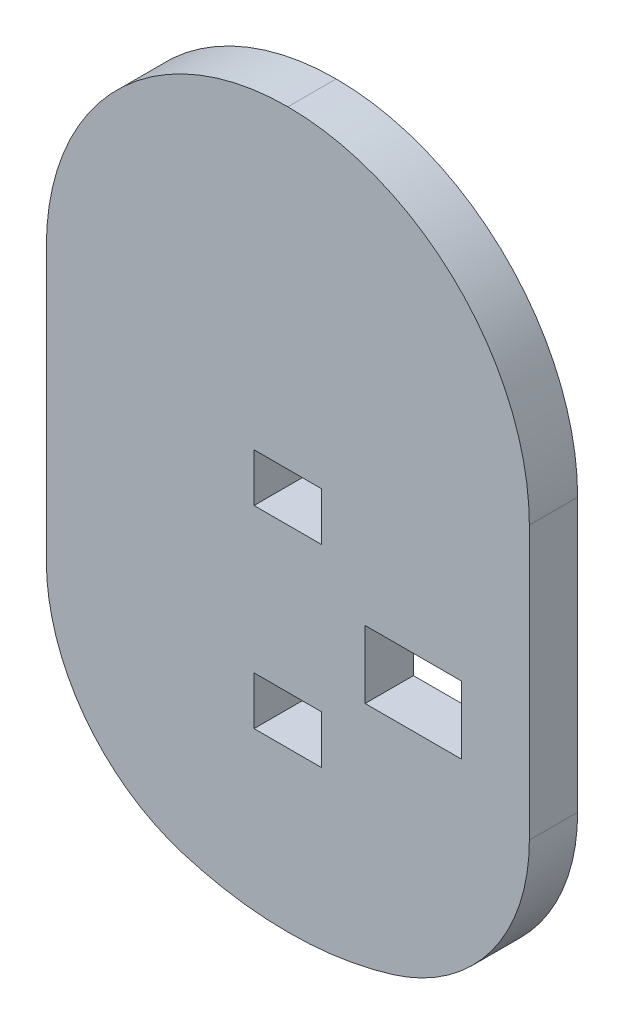
ISO-10303-21;
HEADER;
FILE_DESCRIPTION(('STEP AP214'),'2;1');
FILE_NAME('part.step','',(''),(''),'','','');
FILE_SCHEMA(('AUTOMOTIVE_DESIGN { 1 0 10303 214 1 1 1 1 }'));
ENDSEC;
DATA;
#1=APPLICATION_CONTEXT('core data for automotive mechanical design processes');
#2=APPLICATION_PROTOCOL_DEFINITION('international standard','automotive_design',2000,#1);
#3=PRODUCT_CONTEXT('',#1,'mechanical');
#4=PRODUCT('Part','Part','',(#3));
#5=PRODUCT_RELATED_PRODUCT_CATEGORY('part','',(#4));
#6=PRODUCT_DEFINITION_FORMATION('','',#4);
#7=PRODUCT_DEFINITION_CONTEXT('part definition',#1,'design');
#8=PRODUCT_DEFINITION('design','',#6,#7);
#9=PRODUCT_DEFINITION_SHAPE('','',#8);
#10=(LENGTH_UNIT() NAMED_UNIT(*) SI_UNIT(.MILLI.,.METRE.));
#11=(NAMED_UNIT(*) PLANE_ANGLE_UNIT() SI_UNIT($,.RADIAN.));
#12=(NAMED_UNIT(*) SI_UNIT($,.STERADIAN.) SOLID_ANGLE_UNIT());
#13=UNCERTAINTY_MEASURE_WITH_UNIT(LENGTH_MEASURE(1.E-05),#10,'distance_accuracy_value','');
#14=(GEOMETRIC_REPRESENTATION_CONTEXT(3) GLOBAL_UNCERTAINTY_ASSIGNED_CONTEXT((#13)) GLOBAL_UNIT_ASSIGNED_CONTEXT((#10,
#11,#12)) REPRESENTATION_CONTEXT('',''));
#15=CARTESIAN_POINT('',(0.,0.,0.));
#16=DIRECTION('',(0.,0.,1.));
#17=DIRECTION('',(1.,0.,0.));
#18=AXIS2_PLACEMENT_3D('',#15,#16,#17);
#19=CARTESIAN_POINT('',(0.,0.,5.));
#20=DIRECTION('',(0.,0.,-1.));
#21=DIRECTION('',(-1.,0.,0.));
#22=AXIS2_PLACEMENT_3D('',#19,#20,#21);
#23=CYLINDRICAL_SURFACE('',#22,37.);
#24=CARTESIAN_POINT('',(0.,0.,5.));
#25=DIRECTION('',(0.,0.,1.));
#26=DIRECTION('',(1.,0.,0.));
#27=AXIS2_PLACEMENT_3D('',#24,#25,#26);
#28=CIRCLE('',#27,37.);
#29=CARTESIAN_POINT('',(-10.8823529411765,-35.3634612907683,5.));
#30=VERTEX_POINT('',#29);
#31=CARTESIAN_POINT('',(10.8823529411765,-35.3634612907683,5.));
#32=VERTEX_POINT('',#31);
#33=EDGE_CURVE('E247',#30,#32,#28,.T.);
#34=ORIENTED_EDGE('',*,*,#33,.F.);
#35=DIRECTION('',(0.,0.,-1.));
#36=VECTOR('',#35,1.);
#37=CARTESIAN_POINT('',(-10.8823529411765,-35.3634612907683,5.));
#38=LINE('',#37,#36);
#39=CARTESIAN_POINT('',(-10.8823529411765,-35.3634612907683,0.));
#40=VERTEX_POINT('',#39);
#41=EDGE_CURVE('E283',#30,#40,#38,.T.);
#42=ORIENTED_EDGE('',*,*,#41,.T.);
#43=CARTESIAN_POINT('',(0.,0.,0.));
#44=DIRECTION('',(0.,0.,1.));
#45=DIRECTION('',(1.,0.,0.));
#46=AXIS2_PLACEMENT_3D('',#43,#44,#45);
#47=CIRCLE('',#46,37.);
#48=CARTESIAN_POINT('',(10.8823529411765,-35.3634612907683,0.));
#49=VERTEX_POINT('',#48);
#50=EDGE_CURVE('E243',#40,#49,#47,.T.);
#51=ORIENTED_EDGE('',*,*,#50,.T.);
#52=DIRECTION('',(0.,0.,-1.));
#53=VECTOR('',#52,1.);
#54=CARTESIAN_POINT('',(10.8823529411765,-35.3634612907683,5.));
#55=LINE('',#54,#53);
#56=EDGE_CURVE('E280',#49,#32,#55,.F.);
#57=ORIENTED_EDGE('',*,*,#56,.T.);
#58=EDGE_LOOP('',(#34,#42,#51,#57));
#59=FACE_BOUND('',#58,.T.);
#60=ADVANCED_FACE('F41',(#59),#23,.T.);
#61=CARTESIAN_POINT('',(0.,0.,5.));
#62=DIRECTION('',(0.,0.,1.));
#63=DIRECTION('',(1.,0.,0.));
#64=AXIS2_PLACEMENT_3D('',#61,#62,#63);
#65=PLANE('',#64);
#66=DIRECTION('',(0.,-1.,0.));
#67=VECTOR('',#66,1.);
#68=CARTESIAN_POINT('',(8.00000000000001,-5.5,5.));
#69=LINE('',#68,#67);
#70=CARTESIAN_POINT('',(8.00000000000001,-5.5,5.));
#71=VERTEX_POINT('',#70);
#72=CARTESIAN_POINT('',(8.,-12.5,5.));
#73=VERTEX_POINT('',#72);
#74=EDGE_CURVE('E56',#71,#73,#69,.T.);
#75=ORIENTED_EDGE('',*,*,#74,.F.);
#76=DIRECTION('',(-1.,0.,0.));
#77=VECTOR('',#76,1.);
#78=CARTESIAN_POINT('',(8.00000000000001,-5.5,5.));
#79=LINE('',#78,#77);
#80=CARTESIAN_POINT('',(18.,-5.5,5.));
#81=VERTEX_POINT('',#80);
#82=EDGE_CURVE('E191',#81,#71,#79,.T.);
#83=ORIENTED_EDGE('',*,*,#82,.F.);
#84=DIRECTION('',(0.,1.,0.));
#85=VECTOR('',#84,1.);
#86=CARTESIAN_POINT('',(18.,-5.5,5.));
#87=LINE('',#86,#85);
#88=CARTESIAN_POINT('',(18.,-12.5,5.));
#89=VERTEX_POINT('',#88);
#90=EDGE_CURVE('E175',#89,#81,#87,.T.);
#91=ORIENTED_EDGE('',*,*,#90,.F.);
#92=DIRECTION('',(1.,0.,0.));
#93=VECTOR('',#92,1.);
#94=CARTESIAN_POINT('',(8.,-12.5,5.));
#95=LINE('',#94,#93);
#96=EDGE_CURVE('E184',#73,#89,#95,.T.);
#97=ORIENTED_EDGE('',*,*,#96,.F.);
#98=EDGE_LOOP('',(#75,#83,#91,#97));
#99=FACE_BOUND('',#98,.T.);
#100=DIRECTION('',(0.,1.,0.));
#101=VECTOR('',#100,1.);
#102=CARTESIAN_POINT('',(3.5,4.5,5.));
#103=LINE('',#102,#101);
#104=CARTESIAN_POINT('',(3.5,-0.500000000000003,5.));
#105=VERTEX_POINT('',#104);
#106=CARTESIAN_POINT('',(3.5,4.5,5.));
#107=VERTEX_POINT('',#106);
#108=EDGE_CURVE('E201',#105,#107,#103,.T.);
#109=ORIENTED_EDGE('',*,*,#108,.F.);
#110=DIRECTION('',(1.,0.,0.));
#111=VECTOR('',#110,1.);
#112=CARTESIAN_POINT('',(-3.5,-0.500000000000003,5.));
#113=LINE('',#112,#111);
#114=CARTESIAN_POINT('',(-3.5,-0.500000000000003,5.));
#115=VERTEX_POINT('',#114);
#116=EDGE_CURVE('E210',#115,#105,#113,.T.);
#117=ORIENTED_EDGE('',*,*,#116,.F.);
#118=DIRECTION('',(0.,-1.,0.));
#119=VECTOR('',#118,1.);
#120=CARTESIAN_POINT('',(-3.5,4.5,5.));
#121=LINE('',#120,#119);
#122=CARTESIAN_POINT('',(-3.5,4.5,5.));
#123=VERTEX_POINT('',#122);
#124=EDGE_CURVE('E207',#123,#115,#121,.T.);
#125=ORIENTED_EDGE('',*,*,#124,.F.);
#126=DIRECTION('',(-1.,0.,0.));
#127=VECTOR('',#126,1.);
#128=CARTESIAN_POINT('',(-3.5,4.5,5.));
#129=LINE('',#128,#127);
#130=EDGE_CURVE('E203',#107,#123,#129,.T.);
#131=ORIENTED_EDGE('',*,*,#130,.F.);
#132=EDGE_LOOP('',(#109,#117,#125,#131));
#133=FACE_BOUND('',#132,.T.);
#134=DIRECTION('',(0.,1.,0.));
#135=VECTOR('',#134,1.);
#136=CARTESIAN_POINT('',(3.5,-15.5,5.));
#137=LINE('',#136,#135);
#138=CARTESIAN_POINT('',(3.5,-20.5,5.));
#139=VERTEX_POINT('',#138);
#140=CARTESIAN_POINT('',(3.5,-15.5,5.));
#141=VERTEX_POINT('',#140);
#142=EDGE_CURVE('E198',#139,#141,#137,.T.);
#143=ORIENTED_EDGE('',*,*,#142,.F.);
#144=DIRECTION('',(1.,0.,0.));
#145=VECTOR('',#144,1.);
#146=CARTESIAN_POINT('',(-3.5,-20.5,5.));
#147=LINE('',#146,#145);
#148=CARTESIAN_POINT('',(-3.5,-20.5,5.));
#149=VERTEX_POINT('',#148);
#150=EDGE_CURVE('E230',#149,#139,#147,.T.);
#151=ORIENTED_EDGE('',*,*,#150,.F.);
#152=DIRECTION('',(0.,-1.,0.));
#153=VECTOR('',#152,1.);
#154=CARTESIAN_POINT('',(-3.5,-15.5,5.));
#155=LINE('',#154,#153);
#156=CARTESIAN_POINT('',(-3.5,-15.5,5.));
#157=VERTEX_POINT('',#156);
#158=EDGE_CURVE('E227',#157,#149,#155,.T.);
#159=ORIENTED_EDGE('',*,*,#158,.F.);
#160=DIRECTION('',(-1.,0.,0.));
#161=VECTOR('',#160,1.);
#162=CARTESIAN_POINT('',(-3.5,-15.5,5.));
#163=LINE('',#162,#161);
#164=EDGE_CURVE('E224',#141,#157,#163,.T.);
#165=ORIENTED_EDGE('',*,*,#164,.F.);
#166=EDGE_LOOP('',(#143,#151,#159,#165));
#167=FACE_BOUND('',#166,.T.);
#168=DIRECTION('',(0.,1.,0.));
#169=VECTOR('',#168,1.);
#170=CARTESIAN_POINT('',(-25.,27.2763633939717,5.));
#171=LINE('',#170,#169);
#172=CARTESIAN_POINT('',(-25.,-16.2480768092719,5.));
#173=VERTEX_POINT('',#172);
#174=CARTESIAN_POINT('',(-25.,12.,5.));
#175=VERTEX_POINT('',#174);
#176=EDGE_CURVE('E241',#173,#175,#171,.T.);
#177=ORIENTED_EDGE('',*,*,#176,.F.);
#178=CARTESIAN_POINT('',(-5.,-16.2480768092719,5.));
#179=DIRECTION('',(0.,0.,1.));
#180=DIRECTION('',(1.,0.,0.));
#181=AXIS2_PLACEMENT_3D('',#178,#179,#180);
#182=CIRCLE('',#181,20.);
#183=EDGE_CURVE('E278',#173,#30,#182,.T.);
#184=ORIENTED_EDGE('',*,*,#183,.T.);
#185=ORIENTED_EDGE('',*,*,#33,.T.);
#186=CARTESIAN_POINT('',(5.,-16.2480768092719,5.));
#187=DIRECTION('',(0.,0.,1.));
#188=DIRECTION('',(1.,0.,0.));
#189=AXIS2_PLACEMENT_3D('',#186,#187,#188);
#190=CIRCLE('',#189,20.);
#191=CARTESIAN_POINT('',(25.,-16.2480768092719,5.));
#192=VERTEX_POINT('',#191);
#193=EDGE_CURVE('E276',#32,#192,#190,.T.);
#194=ORIENTED_EDGE('',*,*,#193,.T.);
#195=DIRECTION('',(0.,-1.,0.));
#196=VECTOR('',#195,1.);
#197=CARTESIAN_POINT('',(25.,-27.2763633939717,5.));
#198=LINE('',#197,#196);
#199=CARTESIAN_POINT('',(25.,12.,5.));
#200=VERTEX_POINT('',#199);
#201=EDGE_CURVE('E244',#200,#192,#198,.T.);
#202=ORIENTED_EDGE('',*,*,#201,.F.);
#203=CARTESIAN_POINT('',(0.,12.,5.));
#204=DIRECTION('',(0.,0.,1.));
#205=DIRECTION('',(1.,0.,0.));
#206=AXIS2_PLACEMENT_3D('',#203,#204,#205);
#207=CIRCLE('',#206,25.);
#208=CARTESIAN_POINT('',(0.,37.,5.));
#209=VERTEX_POINT('',#208);
#210=EDGE_CURVE('E257',#200,#209,#207,.T.);
#211=ORIENTED_EDGE('',*,*,#210,.T.);
#212=CARTESIAN_POINT('',(0.,12.,5.));
#213=DIRECTION('',(0.,0.,1.));
#214=DIRECTION('',(1.,0.,0.));
#215=AXIS2_PLACEMENT_3D('',#212,#213,#214);
#216=CIRCLE('',#215,25.);
#217=EDGE_CURVE('E259',#209,#175,#216,.T.);
#218=ORIENTED_EDGE('',*,*,#217,.T.);
#219=EDGE_LOOP('',(#177,#184,#185,#194,#202,#211,#218));
#220=FACE_BOUND('',#219,.T.);
#221=ADVANCED_FACE('F188',(#99,#133,#167,#220),#65,.T.);
#222=CARTESIAN_POINT('',(0.,0.,0.));
#223=DIRECTION('',(0.,0.,1.));
#224=DIRECTION('',(1.,0.,0.));
#225=AXIS2_PLACEMENT_3D('',#222,#223,#224);
#226=PLANE('',#225);
#227=DIRECTION('',(-1.,0.,0.));
#228=VECTOR('',#227,1.);
#229=CARTESIAN_POINT('',(0.,-5.5,0.));
#230=LINE('',#229,#228);
#231=CARTESIAN_POINT('',(18.,-5.5,0.));
#232=VERTEX_POINT('',#231);
#233=CARTESIAN_POINT('',(8.00000000000001,-5.5,0.));
#234=VERTEX_POINT('',#233);
#235=EDGE_CURVE('E49',#232,#234,#230,.T.);
#236=ORIENTED_EDGE('',*,*,#235,.T.);
#237=DIRECTION('',(0.,-1.,0.));
#238=VECTOR('',#237,1.);
#239=CARTESIAN_POINT('',(8.00000000000001,0.,0.));
#240=LINE('',#239,#238);
#241=CARTESIAN_POINT('',(8.,-12.5,0.));
#242=VERTEX_POINT('',#241);
#243=EDGE_CURVE('E11',#234,#242,#240,.T.);
#244=ORIENTED_EDGE('',*,*,#243,.T.);
#245=DIRECTION('',(1.,0.,0.));
#246=VECTOR('',#245,1.);
#247=CARTESIAN_POINT('',(0.,-12.5,0.));
#248=LINE('',#247,#246);
#249=CARTESIAN_POINT('',(18.,-12.5,0.));
#250=VERTEX_POINT('',#249);
#251=EDGE_CURVE('E315',#242,#250,#248,.T.);
#252=ORIENTED_EDGE('',*,*,#251,.T.);
#253=DIRECTION('',(0.,1.,0.));
#254=VECTOR('',#253,1.);
#255=CARTESIAN_POINT('',(18.,0.,0.));
#256=LINE('',#255,#254);
#257=EDGE_CURVE('E178',#250,#232,#256,.T.);
#258=ORIENTED_EDGE('',*,*,#257,.T.);
#259=EDGE_LOOP('',(#236,#244,#252,#258));
#260=FACE_BOUND('',#259,.T.);
#261=DIRECTION('',(1.,0.,0.));
#262=VECTOR('',#261,1.);
#263=CARTESIAN_POINT('',(0.,-0.500000000000003,0.));
#264=LINE('',#263,#262);
#265=CARTESIAN_POINT('',(-3.5,-0.500000000000003,0.));
#266=VERTEX_POINT('',#265);
#267=CARTESIAN_POINT('',(3.5,-0.500000000000003,0.));
#268=VERTEX_POINT('',#267);
#269=EDGE_CURVE('E309',#266,#268,#264,.T.);
#270=ORIENTED_EDGE('',*,*,#269,.T.);
#271=DIRECTION('',(0.,1.,0.));
#272=VECTOR('',#271,1.);
#273=CARTESIAN_POINT('',(3.5,0.,0.));
#274=LINE('',#273,#272);
#275=CARTESIAN_POINT('',(3.5,4.5,0.));
#276=VERTEX_POINT('',#275);
#277=EDGE_CURVE('E312',#268,#276,#274,.T.);
#278=ORIENTED_EDGE('',*,*,#277,.T.);
#279=DIRECTION('',(-1.,0.,0.));
#280=VECTOR('',#279,1.);
#281=CARTESIAN_POINT('',(0.,4.5,0.));
#282=LINE('',#281,#280);
#283=CARTESIAN_POINT('',(-3.5,4.5,0.));
#284=VERTEX_POINT('',#283);
#285=EDGE_CURVE('E303',#276,#284,#282,.T.);
#286=ORIENTED_EDGE('',*,*,#285,.T.);
#287=DIRECTION('',(0.,-1.,0.));
#288=VECTOR('',#287,1.);
#289=CARTESIAN_POINT('',(-3.5,0.,0.));
#290=LINE('',#289,#288);
#291=EDGE_CURVE('E306',#284,#266,#290,.T.);
#292=ORIENTED_EDGE('',*,*,#291,.T.);
#293=EDGE_LOOP('',(#270,#278,#286,#292));
#294=FACE_BOUND('',#293,.T.);
#295=DIRECTION('',(1.,0.,0.));
#296=VECTOR('',#295,1.);
#297=CARTESIAN_POINT('',(0.,-20.5,0.));
#298=LINE('',#297,#296);
#299=CARTESIAN_POINT('',(-3.5,-20.5,0.));
#300=VERTEX_POINT('',#299);
#301=CARTESIAN_POINT('',(3.5,-20.5,0.));
#302=VERTEX_POINT('',#301);
#303=EDGE_CURVE('E297',#300,#302,#298,.T.);
#304=ORIENTED_EDGE('',*,*,#303,.T.);
#305=DIRECTION('',(0.,1.,0.));
#306=VECTOR('',#305,1.);
#307=CARTESIAN_POINT('',(3.5,0.,0.));
#308=LINE('',#307,#306);
#309=CARTESIAN_POINT('',(3.5,-15.5,0.));
#310=VERTEX_POINT('',#309);
#311=EDGE_CURVE('E300',#302,#310,#308,.T.);
#312=ORIENTED_EDGE('',*,*,#311,.T.);
#313=DIRECTION('',(-1.,0.,0.));
#314=VECTOR('',#313,1.);
#315=CARTESIAN_POINT('',(0.,-15.5,0.));
#316=LINE('',#315,#314);
#317=CARTESIAN_POINT('',(-3.5,-15.5,0.));
#318=VERTEX_POINT('',#317);
#319=EDGE_CURVE('E291',#310,#318,#316,.T.);
#320=ORIENTED_EDGE('',*,*,#319,.T.);
#321=DIRECTION('',(0.,-1.,0.));
#322=VECTOR('',#321,1.);
#323=CARTESIAN_POINT('',(-3.5,0.,0.));
#324=LINE('',#323,#322);
#325=EDGE_CURVE('E294',#318,#300,#324,.T.);
#326=ORIENTED_EDGE('',*,*,#325,.T.);
#327=EDGE_LOOP('',(#304,#312,#320,#326));
#328=FACE_BOUND('',#327,.T.);
#329=ORIENTED_EDGE('',*,*,#50,.F.);
#330=CARTESIAN_POINT('',(-5.,-16.2480768092719,0.));
#331=DIRECTION('',(0.,0.,1.));
#332=DIRECTION('',(1.,0.,0.));
#333=AXIS2_PLACEMENT_3D('',#330,#331,#332);
#334=CIRCLE('',#333,20.);
#335=CARTESIAN_POINT('',(-25.,-16.2480768092719,0.));
#336=VERTEX_POINT('',#335);
#337=EDGE_CURVE('E287',#40,#336,#334,.F.);
#338=ORIENTED_EDGE('',*,*,#337,.T.);
#339=DIRECTION('',(0.,1.,0.));
#340=VECTOR('',#339,1.);
#341=CARTESIAN_POINT('',(-25.,0.,0.));
#342=LINE('',#341,#340);
#343=CARTESIAN_POINT('',(-25.,12.,0.));
#344=VERTEX_POINT('',#343);
#345=EDGE_CURVE('E255',#336,#344,#342,.T.);
#346=ORIENTED_EDGE('',*,*,#345,.T.);
#347=CARTESIAN_POINT('',(0.,12.,0.));
#348=DIRECTION('',(0.,0.,1.));
#349=DIRECTION('',(1.,0.,0.));
#350=AXIS2_PLACEMENT_3D('',#347,#348,#349);
#351=CIRCLE('',#350,25.);
#352=CARTESIAN_POINT('',(0.,37.,0.));
#353=VERTEX_POINT('',#352);
#354=EDGE_CURVE('E267',#344,#353,#351,.F.);
#355=ORIENTED_EDGE('',*,*,#354,.T.);
#356=CARTESIAN_POINT('',(0.,12.,0.));
#357=DIRECTION('',(0.,0.,1.));
#358=DIRECTION('',(1.,0.,0.));
#359=AXIS2_PLACEMENT_3D('',#356,#357,#358);
#360=CIRCLE('',#359,25.);
#361=CARTESIAN_POINT('',(25.,12.,0.));
#362=VERTEX_POINT('',#361);
#363=EDGE_CURVE('E265',#353,#362,#360,.F.);
#364=ORIENTED_EDGE('',*,*,#363,.T.);
#365=DIRECTION('',(0.,-1.,0.));
#366=VECTOR('',#365,1.);
#367=CARTESIAN_POINT('',(25.,0.,0.));
#368=LINE('',#367,#366);
#369=CARTESIAN_POINT('',(25.,-16.2480768092719,0.));
#370=VERTEX_POINT('',#369);
#371=EDGE_CURVE('E250',#362,#370,#368,.T.);
#372=ORIENTED_EDGE('',*,*,#371,.T.);
#373=CARTESIAN_POINT('',(5.,-16.2480768092719,0.));
#374=DIRECTION('',(0.,0.,1.));
#375=DIRECTION('',(1.,0.,0.));
#376=AXIS2_PLACEMENT_3D('',#373,#374,#375);
#377=CIRCLE('',#376,20.);
#378=EDGE_CURVE('E285',#370,#49,#377,.F.);
#379=ORIENTED_EDGE('',*,*,#378,.T.);
#380=EDGE_LOOP('',(#329,#338,#346,#355,#364,#372,#379));
#381=FACE_BOUND('',#380,.T.);
#382=ADVANCED_FACE('F319',(#260,#294,#328,#381),#226,.F.);
#383=CARTESIAN_POINT('',(25.,-27.2763633939717,-5.));
#384=DIRECTION('',(-1.,0.,0.));
#385=DIRECTION('',(0.,0.,1.));
#386=AXIS2_PLACEMENT_3D('',#383,#384,#385);
#387=PLANE('',#386);
#388=ORIENTED_EDGE('',*,*,#201,.T.);
#389=DIRECTION('',(0.,0.,-1.));
#390=VECTOR('',#389,1.);
#391=CARTESIAN_POINT('',(25.,-16.2480768092719,-5.));
#392=LINE('',#391,#390);
#393=EDGE_CURVE('E289',#192,#370,#392,.T.);
#394=ORIENTED_EDGE('',*,*,#393,.T.);
#395=ORIENTED_EDGE('',*,*,#371,.F.);
#396=DIRECTION('',(0.,0.,-1.));
#397=VECTOR('',#396,1.);
#398=CARTESIAN_POINT('',(25.,12.,-5.));
#399=LINE('',#398,#397);
#400=EDGE_CURVE('E269',#362,#200,#399,.F.);
#401=ORIENTED_EDGE('',*,*,#400,.T.);
#402=EDGE_LOOP('',(#388,#394,#395,#401));
#403=FACE_BOUND('',#402,.T.);
#404=ADVANCED_FACE('F382',(#403),#387,.F.);
#405=CARTESIAN_POINT('',(-25.,27.2763633939717,-5.));
#406=DIRECTION('',(1.,0.,0.));
#407=DIRECTION('',(0.,0.,-1.));
#408=AXIS2_PLACEMENT_3D('',#405,#406,#407);
#409=PLANE('',#408);
#410=ORIENTED_EDGE('',*,*,#345,.F.);
#411=DIRECTION('',(0.,0.,-1.));
#412=VECTOR('',#411,1.);
#413=CARTESIAN_POINT('',(-25.,-16.2480768092719,-5.));
#414=LINE('',#413,#412);
#415=EDGE_CURVE('E271',#336,#173,#414,.F.);
#416=ORIENTED_EDGE('',*,*,#415,.T.);
#417=ORIENTED_EDGE('',*,*,#176,.T.);
#418=DIRECTION('',(0.,0.,-1.));
#419=VECTOR('',#418,1.);
#420=CARTESIAN_POINT('',(-25.,12.,-5.));
#421=LINE('',#420,#419);
#422=EDGE_CURVE('E262',#175,#344,#421,.T.);
#423=ORIENTED_EDGE('',*,*,#422,.T.);
#424=EDGE_LOOP('',(#410,#416,#417,#423));
#425=FACE_BOUND('',#424,.T.);
#426=ADVANCED_FACE('F355',(#425),#409,.F.);
#427=CARTESIAN_POINT('',(0.,12.,5.));
#428=DIRECTION('',(0.,0.,-1.));
#429=DIRECTION('',(-1.,0.,0.));
#430=AXIS2_PLACEMENT_3D('',#427,#428,#429);
#431=CYLINDRICAL_SURFACE('',#430,25.);
#432=ORIENTED_EDGE('',*,*,#400,.F.);
#433=ORIENTED_EDGE('',*,*,#363,.F.);
#434=DIRECTION('',(0.,0.,-1.));
#435=VECTOR('',#434,1.);
#436=CARTESIAN_POINT('',(0.,37.,5.));
#437=LINE('',#436,#435);
#438=EDGE_CURVE('E216',#209,#353,#437,.T.);
#439=ORIENTED_EDGE('',*,*,#438,.F.);
#440=ORIENTED_EDGE('',*,*,#210,.F.);
#441=EDGE_LOOP('',(#432,#433,#439,#440));
#442=FACE_BOUND('',#441,.T.);
#443=ADVANCED_FACE('F352',(#442),#431,.T.);
#444=CARTESIAN_POINT('',(0.,12.,5.));
#445=DIRECTION('',(0.,0.,-1.));
#446=DIRECTION('',(-1.,0.,0.));
#447=AXIS2_PLACEMENT_3D('',#444,#445,#446);
#448=CYLINDRICAL_SURFACE('',#447,25.);
#449=ORIENTED_EDGE('',*,*,#354,.F.);
#450=ORIENTED_EDGE('',*,*,#422,.F.);
#451=ORIENTED_EDGE('',*,*,#217,.F.);
#452=ORIENTED_EDGE('',*,*,#438,.T.);
#453=EDGE_LOOP('',(#449,#450,#451,#452));
#454=FACE_BOUND('',#453,.T.);
#455=ADVANCED_FACE('F348',(#454),#448,.T.);
#456=CARTESIAN_POINT('',(-5.,-16.2480768092719,5.));
#457=DIRECTION('',(0.,0.,-1.));
#458=DIRECTION('',(-1.,0.,0.));
#459=AXIS2_PLACEMENT_3D('',#456,#457,#458);
#460=CYLINDRICAL_SURFACE('',#459,20.);
#461=ORIENTED_EDGE('',*,*,#337,.F.);
#462=ORIENTED_EDGE('',*,*,#41,.F.);
#463=ORIENTED_EDGE('',*,*,#183,.F.);
#464=ORIENTED_EDGE('',*,*,#415,.F.);
#465=EDGE_LOOP('',(#461,#462,#463,#464));
#466=FACE_BOUND('',#465,.T.);
#467=ADVANCED_FACE('F351',(#466),#460,.T.);
#468=CARTESIAN_POINT('',(5.,-16.2480768092719,5.));
#469=DIRECTION('',(0.,0.,-1.));
#470=DIRECTION('',(-1.,0.,0.));
#471=AXIS2_PLACEMENT_3D('',#468,#469,#470);
#472=CYLINDRICAL_SURFACE('',#471,20.);
#473=ORIENTED_EDGE('',*,*,#378,.F.);
#474=ORIENTED_EDGE('',*,*,#393,.F.);
#475=ORIENTED_EDGE('',*,*,#193,.F.);
#476=ORIENTED_EDGE('',*,*,#56,.F.);
#477=EDGE_LOOP('',(#473,#474,#475,#476));
#478=FACE_BOUND('',#477,.T.);
#479=ADVANCED_FACE('F43',(#478),#472,.T.);
#480=CARTESIAN_POINT('',(3.5,-15.5,-5.));
#481=DIRECTION('',(1.,0.,0.));
#482=DIRECTION('',(0.,1.,0.));
#483=AXIS2_PLACEMENT_3D('',#480,#481,#482);
#484=PLANE('',#483);
#485=DIRECTION('',(0.,0.,1.));
#486=VECTOR('',#485,1.);
#487=CARTESIAN_POINT('',(3.5,-20.5,-5.));
#488=LINE('',#487,#486);
#489=EDGE_CURVE('E204',#302,#139,#488,.T.);
#490=ORIENTED_EDGE('',*,*,#489,.T.);
#491=ORIENTED_EDGE('',*,*,#142,.T.);
#492=DIRECTION('',(0.,0.,1.));
#493=VECTOR('',#492,1.);
#494=CARTESIAN_POINT('',(3.5,-15.5,-5.));
#495=LINE('',#494,#493);
#496=EDGE_CURVE('E233',#310,#141,#495,.T.);
#497=ORIENTED_EDGE('',*,*,#496,.F.);
#498=ORIENTED_EDGE('',*,*,#311,.F.);
#499=EDGE_LOOP('',(#490,#491,#497,#498));
#500=FACE_BOUND('',#499,.T.);
#501=ADVANCED_FACE('F362',(#500),#484,.F.);
#502=CARTESIAN_POINT('',(-3.5,-20.5,-5.));
#503=DIRECTION('',(0.,-1.,0.));
#504=DIRECTION('',(0.,0.,-1.));
#505=AXIS2_PLACEMENT_3D('',#502,#503,#504);
#506=PLANE('',#505);
#507=DIRECTION('',(0.,0.,1.));
#508=VECTOR('',#507,1.);
#509=CARTESIAN_POINT('',(-3.5,-20.5,-5.));
#510=LINE('',#509,#508);
#511=EDGE_CURVE('E235',#300,#149,#510,.T.);
#512=ORIENTED_EDGE('',*,*,#511,.T.);
#513=ORIENTED_EDGE('',*,*,#150,.T.);
#514=ORIENTED_EDGE('',*,*,#489,.F.);
#515=ORIENTED_EDGE('',*,*,#303,.F.);
#516=EDGE_LOOP('',(#512,#513,#514,#515));
#517=FACE_BOUND('',#516,.T.);
#518=ADVANCED_FACE('F397',(#517),#506,.F.);
#519=CARTESIAN_POINT('',(-3.5,-15.5,-5.));
#520=DIRECTION('',(-1.,0.,0.));
#521=DIRECTION('',(0.,-1.,0.));
#522=AXIS2_PLACEMENT_3D('',#519,#520,#521);
#523=PLANE('',#522);
#524=DIRECTION('',(0.,0.,1.));
#525=VECTOR('',#524,1.);
#526=CARTESIAN_POINT('',(-3.5,-15.5,-5.));
#527=LINE('',#526,#525);
#528=EDGE_CURVE('E237',#318,#157,#527,.T.);
#529=ORIENTED_EDGE('',*,*,#528,.T.);
#530=ORIENTED_EDGE('',*,*,#158,.T.);
#531=ORIENTED_EDGE('',*,*,#511,.F.);
#532=ORIENTED_EDGE('',*,*,#325,.F.);
#533=EDGE_LOOP('',(#529,#530,#531,#532));
#534=FACE_BOUND('',#533,.T.);
#535=ADVANCED_FACE('F403',(#534),#523,.F.);
#536=CARTESIAN_POINT('',(-3.5,-15.5,-5.));
#537=DIRECTION('',(0.,1.,0.));
#538=DIRECTION('',(0.,0.,1.));
#539=AXIS2_PLACEMENT_3D('',#536,#537,#538);
#540=PLANE('',#539);
#541=ORIENTED_EDGE('',*,*,#496,.T.);
#542=ORIENTED_EDGE('',*,*,#164,.T.);
#543=ORIENTED_EDGE('',*,*,#528,.F.);
#544=ORIENTED_EDGE('',*,*,#319,.F.);
#545=EDGE_LOOP('',(#541,#542,#543,#544));
#546=FACE_BOUND('',#545,.T.);
#547=ADVANCED_FACE('F399',(#546),#540,.F.);
#548=CARTESIAN_POINT('',(3.5,4.5,-5.));
#549=DIRECTION('',(1.,0.,0.));
#550=DIRECTION('',(0.,1.,0.));
#551=AXIS2_PLACEMENT_3D('',#548,#549,#550);
#552=PLANE('',#551);
#553=DIRECTION('',(0.,0.,1.));
#554=VECTOR('',#553,1.);
#555=CARTESIAN_POINT('',(3.5,-0.500000000000003,-5.));
#556=LINE('',#555,#554);
#557=EDGE_CURVE('E214',#268,#105,#556,.T.);
#558=ORIENTED_EDGE('',*,*,#557,.T.);
#559=ORIENTED_EDGE('',*,*,#108,.T.);
#560=DIRECTION('',(0.,0.,1.));
#561=VECTOR('',#560,1.);
#562=CARTESIAN_POINT('',(3.5,4.5,-5.));
#563=LINE('',#562,#561);
#564=EDGE_CURVE('E213',#276,#107,#563,.T.);
#565=ORIENTED_EDGE('',*,*,#564,.F.);
#566=ORIENTED_EDGE('',*,*,#277,.F.);
#567=EDGE_LOOP('',(#558,#559,#565,#566));
#568=FACE_BOUND('',#567,.T.);
#569=ADVANCED_FACE('F402',(#568),#552,.F.);
#570=CARTESIAN_POINT('',(-3.5,-0.500000000000003,-5.));
#571=DIRECTION('',(0.,-1.,0.));
#572=DIRECTION('',(0.,0.,-1.));
#573=AXIS2_PLACEMENT_3D('',#570,#571,#572);
#574=PLANE('',#573);
#575=DIRECTION('',(0.,0.,1.));
#576=VECTOR('',#575,1.);
#577=CARTESIAN_POINT('',(-3.5,-0.500000000000003,-5.));
#578=LINE('',#577,#576);
#579=EDGE_CURVE('E217',#266,#115,#578,.T.);
#580=ORIENTED_EDGE('',*,*,#579,.T.);
#581=ORIENTED_EDGE('',*,*,#116,.T.);
#582=ORIENTED_EDGE('',*,*,#557,.F.);
#583=ORIENTED_EDGE('',*,*,#269,.F.);
#584=EDGE_LOOP('',(#580,#581,#582,#583));
#585=FACE_BOUND('',#584,.T.);
#586=ADVANCED_FACE('F412',(#585),#574,.F.);
#587=CARTESIAN_POINT('',(-3.5,4.5,-5.));
#588=DIRECTION('',(-1.,0.,0.));
#589=DIRECTION('',(0.,-1.,0.));
#590=AXIS2_PLACEMENT_3D('',#587,#588,#589);
#591=PLANE('',#590);
#592=DIRECTION('',(0.,0.,1.));
#593=VECTOR('',#592,1.);
#594=CARTESIAN_POINT('',(-3.5,4.5,-5.));
#595=LINE('',#594,#593);
#596=EDGE_CURVE('E219',#284,#123,#595,.T.);
#597=ORIENTED_EDGE('',*,*,#596,.T.);
#598=ORIENTED_EDGE('',*,*,#124,.T.);
#599=ORIENTED_EDGE('',*,*,#579,.F.);
#600=ORIENTED_EDGE('',*,*,#291,.F.);
#601=EDGE_LOOP('',(#597,#598,#599,#600));
#602=FACE_BOUND('',#601,.T.);
#603=ADVANCED_FACE('F333',(#602),#591,.F.);
#604=CARTESIAN_POINT('',(-3.5,4.5,-5.));
#605=DIRECTION('',(0.,1.,0.));
#606=DIRECTION('',(0.,0.,1.));
#607=AXIS2_PLACEMENT_3D('',#604,#605,#606);
#608=PLANE('',#607);
#609=ORIENTED_EDGE('',*,*,#564,.T.);
#610=ORIENTED_EDGE('',*,*,#130,.T.);
#611=ORIENTED_EDGE('',*,*,#596,.F.);
#612=ORIENTED_EDGE('',*,*,#285,.F.);
#613=EDGE_LOOP('',(#609,#610,#611,#612));
#614=FACE_BOUND('',#613,.T.);
#615=ADVANCED_FACE('F326',(#614),#608,.F.);
#616=CARTESIAN_POINT('',(8.00000000000001,-5.5,-5.));
#617=DIRECTION('',(-1.,0.,0.));
#618=DIRECTION('',(0.,-1.,0.));
#619=AXIS2_PLACEMENT_3D('',#616,#617,#618);
#620=PLANE('',#619);
#621=DIRECTION('',(0.,0.,1.));
#622=VECTOR('',#621,1.);
#623=CARTESIAN_POINT('',(8.00000000000001,-5.5,-5.));
#624=LINE('',#623,#622);
#625=EDGE_CURVE('E196',#234,#71,#624,.T.);
#626=ORIENTED_EDGE('',*,*,#625,.T.);
#627=ORIENTED_EDGE('',*,*,#74,.T.);
#628=DIRECTION('',(0.,0.,1.));
#629=VECTOR('',#628,1.);
#630=CARTESIAN_POINT('',(8.,-12.5,-5.));
#631=LINE('',#630,#629);
#632=EDGE_CURVE('E181',#242,#73,#631,.T.);
#633=ORIENTED_EDGE('',*,*,#632,.F.);
#634=ORIENTED_EDGE('',*,*,#243,.F.);
#635=EDGE_LOOP('',(#626,#627,#633,#634));
#636=FACE_BOUND('',#635,.T.);
#637=ADVANCED_FACE('F324',(#636),#620,.F.);
#638=CARTESIAN_POINT('',(8.00000000000001,-5.5,-5.));
#639=DIRECTION('',(0.,1.,0.));
#640=DIRECTION('',(0.,0.,1.));
#641=AXIS2_PLACEMENT_3D('',#638,#639,#640);
#642=PLANE('',#641);
#643=DIRECTION('',(0.,0.,1.));
#644=VECTOR('',#643,1.);
#645=CARTESIAN_POINT('',(18.,-5.5,-5.));
#646=LINE('',#645,#644);
#647=EDGE_CURVE('E180',#232,#81,#646,.T.);
#648=ORIENTED_EDGE('',*,*,#647,.T.);
#649=ORIENTED_EDGE('',*,*,#82,.T.);
#650=ORIENTED_EDGE('',*,*,#625,.F.);
#651=ORIENTED_EDGE('',*,*,#235,.F.);
#652=EDGE_LOOP('',(#648,#649,#650,#651));
#653=FACE_BOUND('',#652,.T.);
#654=ADVANCED_FACE('F323',(#653),#642,.F.);
#655=CARTESIAN_POINT('',(18.,-5.5,-5.));
#656=DIRECTION('',(1.,0.,0.));
#657=DIRECTION('',(0.,0.,-1.));
#658=AXIS2_PLACEMENT_3D('',#655,#656,#657);
#659=PLANE('',#658);
#660=DIRECTION('',(0.,0.,1.));
#661=VECTOR('',#660,1.);
#662=CARTESIAN_POINT('',(18.,-12.5,-5.));
#663=LINE('',#662,#661);
#664=EDGE_CURVE('E64',#250,#89,#663,.T.);
#665=ORIENTED_EDGE('',*,*,#664,.T.);
#666=ORIENTED_EDGE('',*,*,#90,.T.);
#667=ORIENTED_EDGE('',*,*,#647,.F.);
#668=ORIENTED_EDGE('',*,*,#257,.F.);
#669=EDGE_LOOP('',(#665,#666,#667,#668));
#670=FACE_BOUND('',#669,.T.);
#671=ADVANCED_FACE('F172',(#670),#659,.F.);
#672=CARTESIAN_POINT('',(8.,-12.5,-5.));
#673=DIRECTION('',(0.,-1.,0.));
#674=DIRECTION('',(0.,0.,-1.));
#675=AXIS2_PLACEMENT_3D('',#672,#673,#674);
#676=PLANE('',#675);
#677=ORIENTED_EDGE('',*,*,#632,.T.);
#678=ORIENTED_EDGE('',*,*,#96,.T.);
#679=ORIENTED_EDGE('',*,*,#664,.F.);
#680=ORIENTED_EDGE('',*,*,#251,.F.);
#681=EDGE_LOOP('',(#677,#678,#679,#680));
#682=FACE_BOUND('',#681,.T.);
#683=ADVANCED_FACE('F185',(#682),#676,.F.);
#684=CLOSED_SHELL('',(#60,#221,#382,#404,#426,#443,#455,#467,#479,#501,#518,#535,#547,#569,#586,
#603,#615,#637,#654,#671,#683));
#685=MANIFOLD_SOLID_BREP('B2',#684);
#686=ADVANCED_BREP_SHAPE_REPRESENTATION('',(#18,#685),#14);
#687=SHAPE_DEFINITION_REPRESENTATION(#9,#686);
ENDSEC;
END-ISO-10303-21;
